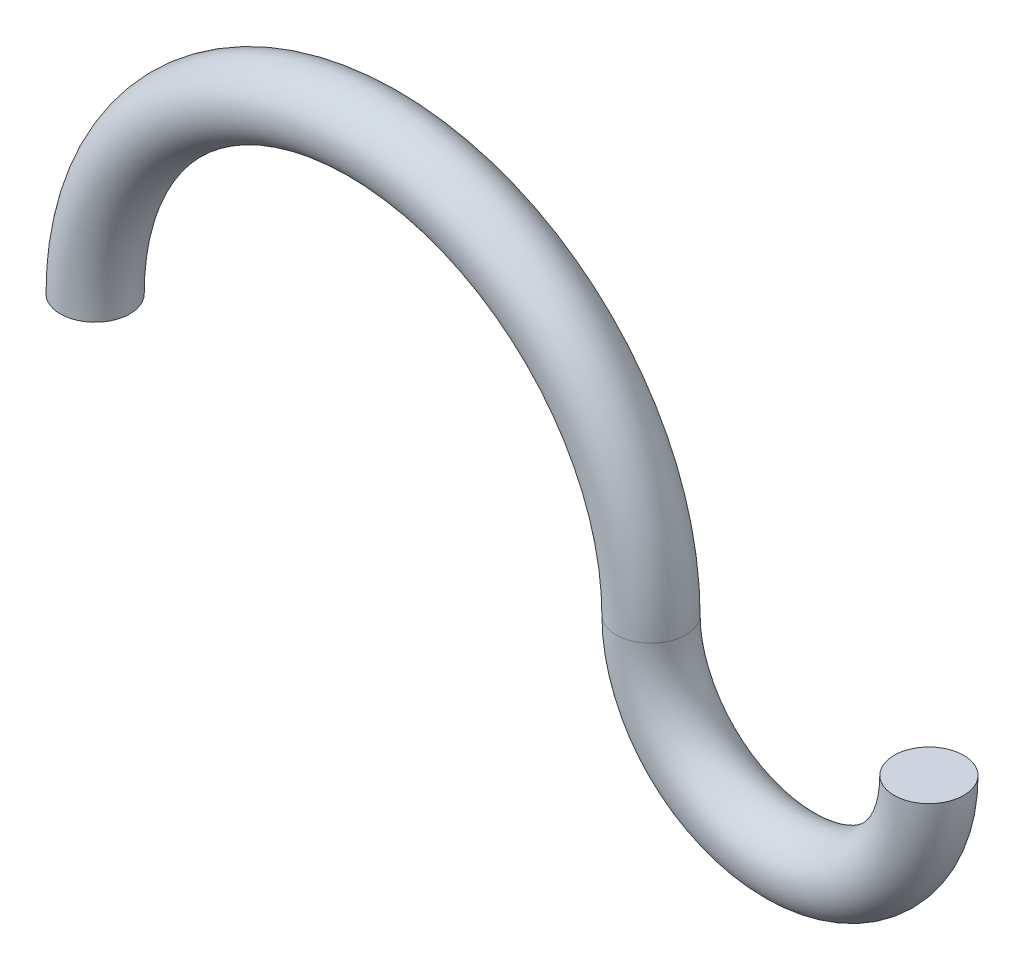
ISO-10303-21;
HEADER;
FILE_DESCRIPTION(('STEP AP214'),'2;1');
FILE_NAME('part.step','',(''),(''),'','','');
FILE_SCHEMA(('AUTOMOTIVE_DESIGN { 1 0 10303 214 1 1 1 1 }'));
ENDSEC;
DATA;
#1=APPLICATION_CONTEXT('core data for automotive mechanical design processes');
#2=APPLICATION_PROTOCOL_DEFINITION('international standard','automotive_design',2000,#1);
#3=PRODUCT_CONTEXT('',#1,'mechanical');
#4=PRODUCT('Part','Part','',(#3));
#5=PRODUCT_RELATED_PRODUCT_CATEGORY('part','',(#4));
#6=PRODUCT_DEFINITION_FORMATION('','',#4);
#7=PRODUCT_DEFINITION_CONTEXT('part definition',#1,'design');
#8=PRODUCT_DEFINITION('design','',#6,#7);
#9=PRODUCT_DEFINITION_SHAPE('','',#8);
#10=(LENGTH_UNIT() NAMED_UNIT(*) SI_UNIT(.MILLI.,.METRE.));
#11=(NAMED_UNIT(*) PLANE_ANGLE_UNIT() SI_UNIT($,.RADIAN.));
#12=(NAMED_UNIT(*) SI_UNIT($,.STERADIAN.) SOLID_ANGLE_UNIT());
#13=UNCERTAINTY_MEASURE_WITH_UNIT(LENGTH_MEASURE(1.E-05),#10,'distance_accuracy_value','');
#14=(GEOMETRIC_REPRESENTATION_CONTEXT(3) GLOBAL_UNCERTAINTY_ASSIGNED_CONTEXT((#13)) GLOBAL_UNIT_ASSIGNED_CONTEXT((#10,
#11,#12)) REPRESENTATION_CONTEXT('',''));
#15=CARTESIAN_POINT('',(0.,0.,0.));
#16=DIRECTION('',(0.,0.,1.));
#17=DIRECTION('',(1.,0.,0.));
#18=AXIS2_PLACEMENT_3D('',#15,#16,#17);
#19=CARTESIAN_POINT('',(10.,0.,0.));
#20=DIRECTION('',(0.,1.,0.));
#21=DIRECTION('',(0.,0.,1.));
#22=AXIS2_PLACEMENT_3D('',#19,#20,#21);
#23=PLANE('',#22);
#24=CARTESIAN_POINT('',(10.,0.,0.));
#25=DIRECTION('',(0.,1.,0.));
#26=DIRECTION('',(0.,0.,1.));
#27=AXIS2_PLACEMENT_3D('',#24,#25,#26);
#28=CIRCLE('',#27,2.5);
#29=CARTESIAN_POINT('',(12.5,0.,0.));
#30=VERTEX_POINT('',#29);
#31=EDGE_CURVE('E43',#30,#30,#28,.T.);
#32=ORIENTED_EDGE('',*,*,#31,.T.);
#33=EDGE_LOOP('',(#32));
#34=FACE_BOUND('',#33,.T.);
#35=ADVANCED_FACE('F33',(#34),#23,.T.);
#36=CARTESIAN_POINT('',(-50.,0.,0.));
#37=DIRECTION('',(0.,1.,0.));
#38=DIRECTION('',(0.,0.,1.));
#39=AXIS2_PLACEMENT_3D('',#36,#37,#38);
#40=PLANE('',#39);
#41=CARTESIAN_POINT('',(-50.,0.,0.));
#42=DIRECTION('',(0.,1.,0.));
#43=DIRECTION('',(0.,0.,1.));
#44=AXIS2_PLACEMENT_3D('',#41,#42,#43);
#45=CIRCLE('',#44,2.5);
#46=CARTESIAN_POINT('',(-50.,0.,2.5));
#47=VERTEX_POINT('',#46);
#48=EDGE_CURVE('E10',#47,#47,#45,.T.);
#49=ORIENTED_EDGE('',*,*,#48,.F.);
#50=EDGE_LOOP('',(#49));
#51=FACE_BOUND('',#50,.T.);
#52=ADVANCED_FACE('F54',(#51),#40,.F.);
#53=CARTESIAN_POINT('',(0.,0.,0.));
#54=DIRECTION('',(0.,0.,-1.));
#55=DIRECTION('',(-1.,0.,0.));
#56=AXIS2_PLACEMENT_3D('',#53,#54,#55);
#57=TOROIDAL_SURFACE('',#56,10.,2.5);
#58=CARTESIAN_POINT('',(-10.,2.25738081764909E-13,0.));
#59=DIRECTION('',(0.,-1.,0.));
#60=DIRECTION('',(0.,0.,1.));
#61=AXIS2_PLACEMENT_3D('',#58,#59,#60);
#62=CIRCLE('',#61,2.5);
#63=CARTESIAN_POINT('',(-12.5,2.82172602206137E-13,0.));
#64=VERTEX_POINT('',#63);
#65=EDGE_CURVE('E39',#64,#64,#62,.T.);
#66=CARTESIAN_POINT('',(0.,0.,0.));
#67=DIRECTION('',(0.,0.,-1.));
#68=DIRECTION('',(-1.,0.,0.));
#69=AXIS2_PLACEMENT_3D('',#66,#67,#68);
#70=CIRCLE('',#69,12.5);
#71=EDGE_CURVE('',#30,#64,#70,.T.);
#72=ORIENTED_EDGE('',*,*,#31,.F.);
#73=ORIENTED_EDGE('',*,*,#65,.T.);
#74=ORIENTED_EDGE('',*,*,#71,.T.);
#75=ORIENTED_EDGE('',*,*,#71,.F.);
#76=EDGE_LOOP('',(#72,#74,#73,#75));
#77=FACE_BOUND('',#76,.T.);
#78=ADVANCED_FACE('F51',(#77),#57,.T.);
#79=CARTESIAN_POINT('',(-30.,1.16707377802599E-13,0.));
#80=DIRECTION('',(0.,0.,1.));
#81=DIRECTION('',(1.,0.,0.));
#82=AXIS2_PLACEMENT_3D('',#79,#80,#81);
#83=TOROIDAL_SURFACE('',#82,20.,2.5);
#84=ORIENTED_EDGE('',*,*,#48,.T.);
#85=EDGE_LOOP('',(#84));
#86=FACE_BOUND('',#85,.T.);
#87=ORIENTED_EDGE('',*,*,#65,.F.);
#88=EDGE_LOOP('',(#87));
#89=FACE_BOUND('',#88,.T.);
#90=ADVANCED_FACE('F53',(#86,#89),#83,.T.);
#91=CLOSED_SHELL('',(#35,#52,#78,#90));
#92=MANIFOLD_SOLID_BREP('B2',#91);
#93=ADVANCED_BREP_SHAPE_REPRESENTATION('',(#18,#92),#14);
#94=SHAPE_DEFINITION_REPRESENTATION(#9,#93);
ENDSEC;
END-ISO-10303-21;
